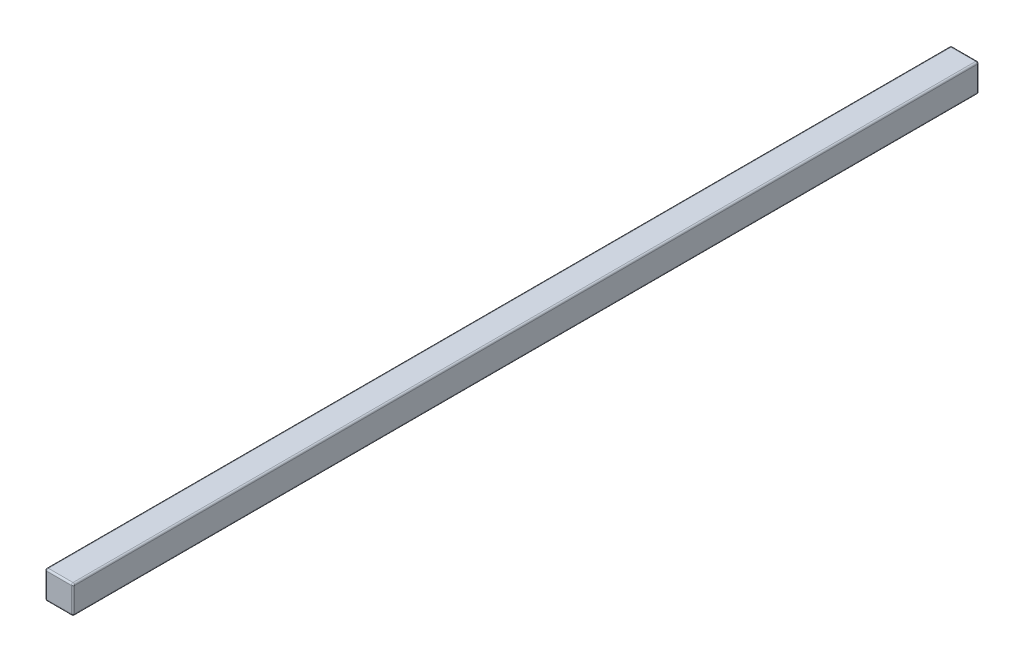
ISO-10303-21;
HEADER;
FILE_DESCRIPTION(('STEP AP214'),'2;1');
FILE_NAME('part.step','',(''),(''),'','','');
FILE_SCHEMA(('AUTOMOTIVE_DESIGN { 1 0 10303 214 1 1 1 1 }'));
ENDSEC;
DATA;
#1=APPLICATION_CONTEXT('core data for automotive mechanical design processes');
#2=APPLICATION_PROTOCOL_DEFINITION('international standard','automotive_design',2000,#1);
#3=PRODUCT_CONTEXT('',#1,'mechanical');
#4=PRODUCT('Part','Part','',(#3));
#5=PRODUCT_RELATED_PRODUCT_CATEGORY('part','',(#4));
#6=PRODUCT_DEFINITION_FORMATION('','',#4);
#7=PRODUCT_DEFINITION_CONTEXT('part definition',#1,'design');
#8=PRODUCT_DEFINITION('design','',#6,#7);
#9=PRODUCT_DEFINITION_SHAPE('','',#8);
#10=(LENGTH_UNIT() NAMED_UNIT(*) SI_UNIT(.MILLI.,.METRE.));
#11=(NAMED_UNIT(*) PLANE_ANGLE_UNIT() SI_UNIT($,.RADIAN.));
#12=(NAMED_UNIT(*) SI_UNIT($,.STERADIAN.) SOLID_ANGLE_UNIT());
#13=UNCERTAINTY_MEASURE_WITH_UNIT(LENGTH_MEASURE(1.E-05),#10,'distance_accuracy_value','');
#14=(GEOMETRIC_REPRESENTATION_CONTEXT(3) GLOBAL_UNCERTAINTY_ASSIGNED_CONTEXT((#13)) GLOBAL_UNIT_ASSIGNED_CONTEXT((#10,
#11,#12)) REPRESENTATION_CONTEXT('',''));
#15=CARTESIAN_POINT('',(0.,0.,0.));
#16=DIRECTION('',(0.,0.,1.));
#17=DIRECTION('',(1.,0.,0.));
#18=AXIS2_PLACEMENT_3D('',#15,#16,#17);
#19=CARTESIAN_POINT('',(12.5,-12.5,808.79));
#20=DIRECTION('',(-1.,0.,0.));
#21=DIRECTION('',(0.,0.,1.));
#22=AXIS2_PLACEMENT_3D('',#19,#20,#21);
#23=PLANE('',#22);
#24=DIRECTION('',(0.,1.,0.));
#25=VECTOR('',#24,1.);
#26=CARTESIAN_POINT('',(12.5,-12.5,807.29));
#27=LINE('',#26,#25);
#28=CARTESIAN_POINT('',(12.5,11.,807.29));
#29=VERTEX_POINT('',#28);
#30=CARTESIAN_POINT('',(12.5,-11.,807.29));
#31=VERTEX_POINT('',#30);
#32=EDGE_CURVE('E156',#29,#31,#27,.F.);
#33=ORIENTED_EDGE('',*,*,#32,.T.);
#34=DIRECTION('',(0.,0.,-1.));
#35=VECTOR('',#34,1.);
#36=CARTESIAN_POINT('',(12.5,-11.,808.79));
#37=LINE('',#36,#35);
#38=CARTESIAN_POINT('',(12.5,-11.,1.49999999999995));
#39=VERTEX_POINT('',#38);
#40=EDGE_CURVE('E235',#31,#39,#37,.T.);
#41=ORIENTED_EDGE('',*,*,#40,.T.);
#42=DIRECTION('',(0.,1.,0.));
#43=VECTOR('',#42,1.);
#44=CARTESIAN_POINT('',(12.5,12.5,1.49999999999995));
#45=LINE('',#44,#43);
#46=CARTESIAN_POINT('',(12.5,11.,1.49999999999995));
#47=VERTEX_POINT('',#46);
#48=EDGE_CURVE('E232',#39,#47,#45,.T.);
#49=ORIENTED_EDGE('',*,*,#48,.T.);
#50=DIRECTION('',(0.,0.,-1.));
#51=VECTOR('',#50,1.);
#52=CARTESIAN_POINT('',(12.5,11.,808.79));
#53=LINE('',#52,#51);
#54=EDGE_CURVE('E230',#47,#29,#53,.F.);
#55=ORIENTED_EDGE('',*,*,#54,.T.);
#56=EDGE_LOOP('',(#33,#41,#49,#55));
#57=FACE_BOUND('',#56,.T.);
#58=ADVANCED_FACE('F37',(#57),#23,.F.);
#59=CARTESIAN_POINT('',(-12.5,12.5,808.79));
#60=DIRECTION('',(0.,-1.,0.));
#61=DIRECTION('',(0.,0.,-1.));
#62=AXIS2_PLACEMENT_3D('',#59,#60,#61);
#63=PLANE('',#62);
#64=DIRECTION('',(-1.,0.,0.));
#65=VECTOR('',#64,1.);
#66=CARTESIAN_POINT('',(-12.5,12.5,807.29));
#67=LINE('',#66,#65);
#68=CARTESIAN_POINT('',(-11.,12.5,807.29));
#69=VERTEX_POINT('',#68);
#70=CARTESIAN_POINT('',(11.,12.5,807.29));
#71=VERTEX_POINT('',#70);
#72=EDGE_CURVE('E46',#69,#71,#67,.F.);
#73=ORIENTED_EDGE('',*,*,#72,.T.);
#74=DIRECTION('',(0.,0.,-1.));
#75=VECTOR('',#74,1.);
#76=CARTESIAN_POINT('',(11.,12.5,808.79));
#77=LINE('',#76,#75);
#78=CARTESIAN_POINT('',(11.,12.5,1.49999999999995));
#79=VERTEX_POINT('',#78);
#80=EDGE_CURVE('E11',#71,#79,#77,.T.);
#81=ORIENTED_EDGE('',*,*,#80,.T.);
#82=DIRECTION('',(-1.,0.,0.));
#83=VECTOR('',#82,1.);
#84=CARTESIAN_POINT('',(-12.5,12.5,1.49999999999995));
#85=LINE('',#84,#83);
#86=CARTESIAN_POINT('',(-11.,12.5,1.49999999999995));
#87=VERTEX_POINT('',#86);
#88=EDGE_CURVE('E238',#79,#87,#85,.T.);
#89=ORIENTED_EDGE('',*,*,#88,.T.);
#90=DIRECTION('',(0.,0.,-1.));
#91=VECTOR('',#90,1.);
#92=CARTESIAN_POINT('',(-11.,12.5,808.79));
#93=LINE('',#92,#91);
#94=EDGE_CURVE('E57',#87,#69,#93,.F.);
#95=ORIENTED_EDGE('',*,*,#94,.T.);
#96=EDGE_LOOP('',(#73,#81,#89,#95));
#97=FACE_BOUND('',#96,.T.);
#98=ADVANCED_FACE('F328',(#97),#63,.F.);
#99=CARTESIAN_POINT('',(-12.5,-12.5,808.79));
#100=DIRECTION('',(1.,0.,0.));
#101=DIRECTION('',(0.,0.,-1.));
#102=AXIS2_PLACEMENT_3D('',#99,#100,#101);
#103=PLANE('',#102);
#104=DIRECTION('',(0.,0.,-1.));
#105=VECTOR('',#104,1.);
#106=CARTESIAN_POINT('',(-12.5,-11.,808.79));
#107=LINE('',#106,#105);
#108=CARTESIAN_POINT('',(-12.5,-11.,1.49999999999995));
#109=VERTEX_POINT('',#108);
#110=CARTESIAN_POINT('',(-12.5,-11.,807.29));
#111=VERTEX_POINT('',#110);
#112=EDGE_CURVE('E219',#109,#111,#107,.F.);
#113=ORIENTED_EDGE('',*,*,#112,.T.);
#114=DIRECTION('',(0.,-1.,0.));
#115=VECTOR('',#114,1.);
#116=CARTESIAN_POINT('',(-12.5,-12.5,807.29));
#117=LINE('',#116,#115);
#118=CARTESIAN_POINT('',(-12.5,11.,807.29));
#119=VERTEX_POINT('',#118);
#120=EDGE_CURVE('E222',#111,#119,#117,.F.);
#121=ORIENTED_EDGE('',*,*,#120,.T.);
#122=DIRECTION('',(0.,0.,-1.));
#123=VECTOR('',#122,1.);
#124=CARTESIAN_POINT('',(-12.5,11.,808.79));
#125=LINE('',#124,#123);
#126=CARTESIAN_POINT('',(-12.5,11.,1.49999999999995));
#127=VERTEX_POINT('',#126);
#128=EDGE_CURVE('E220',#119,#127,#125,.T.);
#129=ORIENTED_EDGE('',*,*,#128,.T.);
#130=DIRECTION('',(0.,-1.,0.));
#131=VECTOR('',#130,1.);
#132=CARTESIAN_POINT('',(-12.5,-12.5,1.49999999999995));
#133=LINE('',#132,#131);
#134=EDGE_CURVE('E216',#127,#109,#133,.T.);
#135=ORIENTED_EDGE('',*,*,#134,.T.);
#136=EDGE_LOOP('',(#113,#121,#129,#135));
#137=FACE_BOUND('',#136,.T.);
#138=ADVANCED_FACE('F310',(#137),#103,.F.);
#139=CARTESIAN_POINT('',(-12.5,-12.5,808.79));
#140=DIRECTION('',(0.,1.,0.));
#141=DIRECTION('',(0.,0.,1.));
#142=AXIS2_PLACEMENT_3D('',#139,#140,#141);
#143=PLANE('',#142);
#144=DIRECTION('',(1.,0.,0.));
#145=VECTOR('',#144,1.);
#146=CARTESIAN_POINT('',(-12.5,-12.5,807.29));
#147=LINE('',#146,#145);
#148=CARTESIAN_POINT('',(11.,-12.5,807.29));
#149=VERTEX_POINT('',#148);
#150=CARTESIAN_POINT('',(-11.,-12.5,807.29));
#151=VERTEX_POINT('',#150);
#152=EDGE_CURVE('E269',#149,#151,#147,.F.);
#153=ORIENTED_EDGE('',*,*,#152,.T.);
#154=DIRECTION('',(0.,0.,-1.));
#155=VECTOR('',#154,1.);
#156=CARTESIAN_POINT('',(-11.,-12.5,808.79));
#157=LINE('',#156,#155);
#158=CARTESIAN_POINT('',(-11.,-12.5,1.49999999999995));
#159=VERTEX_POINT('',#158);
#160=EDGE_CURVE('E263',#151,#159,#157,.T.);
#161=ORIENTED_EDGE('',*,*,#160,.T.);
#162=DIRECTION('',(1.,0.,0.));
#163=VECTOR('',#162,1.);
#164=CARTESIAN_POINT('',(12.5,-12.5,1.49999999999995));
#165=LINE('',#164,#163);
#166=CARTESIAN_POINT('',(11.,-12.5,1.49999999999995));
#167=VERTEX_POINT('',#166);
#168=EDGE_CURVE('E278',#159,#167,#165,.T.);
#169=ORIENTED_EDGE('',*,*,#168,.T.);
#170=DIRECTION('',(0.,0.,-1.));
#171=VECTOR('',#170,1.);
#172=CARTESIAN_POINT('',(11.,-12.5,808.79));
#173=LINE('',#172,#171);
#174=EDGE_CURVE('E274',#167,#149,#173,.F.);
#175=ORIENTED_EDGE('',*,*,#174,.T.);
#176=EDGE_LOOP('',(#153,#161,#169,#175));
#177=FACE_BOUND('',#176,.T.);
#178=ADVANCED_FACE('F272',(#177),#143,.F.);
#179=CARTESIAN_POINT('',(0.,0.,808.79));
#180=DIRECTION('',(0.,0.,-1.));
#181=DIRECTION('',(-1.,0.,0.));
#182=AXIS2_PLACEMENT_3D('',#179,#180,#181);
#183=PLANE('',#182);
#184=DIRECTION('',(0.,-1.,0.));
#185=VECTOR('',#184,1.);
#186=CARTESIAN_POINT('',(-11.,0.,808.79));
#187=LINE('',#186,#185);
#188=CARTESIAN_POINT('',(-11.,11.,808.79));
#189=VERTEX_POINT('',#188);
#190=CARTESIAN_POINT('',(-11.,-11.,808.79));
#191=VERTEX_POINT('',#190);
#192=EDGE_CURVE('E135',#189,#191,#187,.T.);
#193=ORIENTED_EDGE('',*,*,#192,.T.);
#194=DIRECTION('',(1.,0.,0.));
#195=VECTOR('',#194,1.);
#196=CARTESIAN_POINT('',(0.,-11.,808.79));
#197=LINE('',#196,#195);
#198=CARTESIAN_POINT('',(11.,-11.,808.79));
#199=VERTEX_POINT('',#198);
#200=EDGE_CURVE('E131',#191,#199,#197,.T.);
#201=ORIENTED_EDGE('',*,*,#200,.T.);
#202=DIRECTION('',(0.,1.,0.));
#203=VECTOR('',#202,1.);
#204=CARTESIAN_POINT('',(11.,0.,808.79));
#205=LINE('',#204,#203);
#206=CARTESIAN_POINT('',(11.,11.,808.79));
#207=VERTEX_POINT('',#206);
#208=EDGE_CURVE('E125',#199,#207,#205,.T.);
#209=ORIENTED_EDGE('',*,*,#208,.T.);
#210=DIRECTION('',(-1.,0.,0.));
#211=VECTOR('',#210,1.);
#212=CARTESIAN_POINT('',(0.,11.,808.79));
#213=LINE('',#212,#211);
#214=EDGE_CURVE('E128',#207,#189,#213,.T.);
#215=ORIENTED_EDGE('',*,*,#214,.T.);
#216=EDGE_LOOP('',(#193,#201,#209,#215));
#217=FACE_BOUND('',#216,.T.);
#218=ADVANCED_FACE('F127',(#217),#183,.F.);
#219=CARTESIAN_POINT('',(0.,0.,0.));
#220=DIRECTION('',(0.,0.,-1.));
#221=DIRECTION('',(-1.,0.,0.));
#222=AXIS2_PLACEMENT_3D('',#219,#220,#221);
#223=PLANE('',#222);
#224=DIRECTION('',(0.,1.,0.));
#225=VECTOR('',#224,1.);
#226=CARTESIAN_POINT('',(11.,-12.5,0.));
#227=LINE('',#226,#225);
#228=CARTESIAN_POINT('',(11.,11.,0.));
#229=VERTEX_POINT('',#228);
#230=CARTESIAN_POINT('',(11.,-11.,0.));
#231=VERTEX_POINT('',#230);
#232=EDGE_CURVE('E284',#229,#231,#227,.F.);
#233=ORIENTED_EDGE('',*,*,#232,.T.);
#234=DIRECTION('',(1.,0.,0.));
#235=VECTOR('',#234,1.);
#236=CARTESIAN_POINT('',(-12.5,-11.,0.));
#237=LINE('',#236,#235);
#238=CARTESIAN_POINT('',(-11.,-11.,0.));
#239=VERTEX_POINT('',#238);
#240=EDGE_CURVE('E224',#231,#239,#237,.F.);
#241=ORIENTED_EDGE('',*,*,#240,.T.);
#242=DIRECTION('',(0.,-1.,0.));
#243=VECTOR('',#242,1.);
#244=CARTESIAN_POINT('',(-11.,12.5,0.));
#245=LINE('',#244,#243);
#246=CARTESIAN_POINT('',(-11.,11.,0.));
#247=VERTEX_POINT('',#246);
#248=EDGE_CURVE('E214',#239,#247,#245,.F.);
#249=ORIENTED_EDGE('',*,*,#248,.T.);
#250=DIRECTION('',(-1.,0.,0.));
#251=VECTOR('',#250,1.);
#252=CARTESIAN_POINT('',(12.5,11.,0.));
#253=LINE('',#252,#251);
#254=EDGE_CURVE('E268',#247,#229,#253,.F.);
#255=ORIENTED_EDGE('',*,*,#254,.T.);
#256=EDGE_LOOP('',(#233,#241,#249,#255));
#257=FACE_BOUND('',#256,.T.);
#258=ADVANCED_FACE('F288',(#257),#223,.T.);
#259=CARTESIAN_POINT('',(-12.5,11.,1.49999999999995));
#260=DIRECTION('',(1.,0.,0.));
#261=DIRECTION('',(0.,0.,-1.));
#262=AXIS2_PLACEMENT_3D('',#259,#260,#261);
#263=CYLINDRICAL_SURFACE('',#262,1.5);
#264=CARTESIAN_POINT('',(-11.,11.,1.49999999999995));
#265=DIRECTION('',(-1.,0.,0.));
#266=DIRECTION('',(0.,0.,1.));
#267=AXIS2_PLACEMENT_3D('',#264,#265,#266);
#268=CIRCLE('',#267,1.5);
#269=EDGE_CURVE('E41',#87,#247,#268,.T.);
#270=ORIENTED_EDGE('',*,*,#269,.F.);
#271=ORIENTED_EDGE('',*,*,#88,.F.);
#272=CARTESIAN_POINT('',(11.,11.,1.5));
#273=DIRECTION('',(1.,0.,0.));
#274=DIRECTION('',(0.,1.,0.));
#275=AXIS2_PLACEMENT_3D('',#272,#273,#274);
#276=CIRCLE('',#275,1.5);
#277=EDGE_CURVE('E194',#229,#79,#276,.T.);
#278=ORIENTED_EDGE('',*,*,#277,.F.);
#279=ORIENTED_EDGE('',*,*,#254,.F.);
#280=EDGE_LOOP('',(#270,#271,#278,#279));
#281=FACE_BOUND('',#280,.T.);
#282=ADVANCED_FACE('F39',(#281),#263,.T.);
#283=CARTESIAN_POINT('',(-11.,11.,1.5));
#284=DIRECTION('',(0.,0.,1.));
#285=DIRECTION('',(1.,0.,0.));
#286=AXIS2_PLACEMENT_3D('',#283,#284,#285);
#287=SPHERICAL_SURFACE('',#286,1.5);
#288=CARTESIAN_POINT('',(-11.,11.,1.49999999999995));
#289=DIRECTION('',(0.,0.,-1.));
#290=DIRECTION('',(-1.,0.,0.));
#291=AXIS2_PLACEMENT_3D('',#288,#289,#290);
#292=CIRCLE('',#291,1.5);
#293=EDGE_CURVE('E189',#87,#127,#292,.F.);
#294=ORIENTED_EDGE('',*,*,#293,.F.);
#295=ORIENTED_EDGE('',*,*,#269,.T.);
#296=CARTESIAN_POINT('',(-11.,11.,1.5));
#297=DIRECTION('',(0.,1.,0.));
#298=DIRECTION('',(-1.,0.,0.));
#299=AXIS2_PLACEMENT_3D('',#296,#297,#298);
#300=CIRCLE('',#299,1.5);
#301=EDGE_CURVE('E192',#127,#247,#300,.F.);
#302=ORIENTED_EDGE('',*,*,#301,.F.);
#303=EDGE_LOOP('',(#294,#295,#302));
#304=FACE_BOUND('',#303,.T.);
#305=ADVANCED_FACE('F206',(#304),#287,.T.);
#306=CARTESIAN_POINT('',(11.,11.,1.5));
#307=DIRECTION('',(0.,0.,1.));
#308=DIRECTION('',(1.,0.,0.));
#309=AXIS2_PLACEMENT_3D('',#306,#307,#308);
#310=SPHERICAL_SURFACE('',#309,1.5);
#311=CARTESIAN_POINT('',(11.,11.,1.49999999999995));
#312=DIRECTION('',(0.,1.,0.));
#313=DIRECTION('',(0.,0.,1.));
#314=AXIS2_PLACEMENT_3D('',#311,#312,#313);
#315=CIRCLE('',#314,1.5);
#316=EDGE_CURVE('E184',#229,#47,#315,.F.);
#317=ORIENTED_EDGE('',*,*,#316,.F.);
#318=ORIENTED_EDGE('',*,*,#277,.T.);
#319=CARTESIAN_POINT('',(11.,11.,1.49999999999995));
#320=DIRECTION('',(0.,0.,-1.));
#321=DIRECTION('',(-1.,0.,0.));
#322=AXIS2_PLACEMENT_3D('',#319,#320,#321);
#323=CIRCLE('',#322,1.5);
#324=EDGE_CURVE('E187',#47,#79,#323,.F.);
#325=ORIENTED_EDGE('',*,*,#324,.F.);
#326=EDGE_LOOP('',(#317,#318,#325));
#327=FACE_BOUND('',#326,.T.);
#328=ADVANCED_FACE('F461',(#327),#310,.T.);
#329=CARTESIAN_POINT('',(-11.,-12.5,1.49999999999995));
#330=DIRECTION('',(0.,1.,0.));
#331=DIRECTION('',(0.,0.,1.));
#332=AXIS2_PLACEMENT_3D('',#329,#330,#331);
#333=CYLINDRICAL_SURFACE('',#332,1.5);
#334=ORIENTED_EDGE('',*,*,#301,.T.);
#335=ORIENTED_EDGE('',*,*,#248,.F.);
#336=CARTESIAN_POINT('',(-11.,-11.,1.49999999999995));
#337=DIRECTION('',(0.,-1.,0.));
#338=DIRECTION('',(0.,0.,-1.));
#339=AXIS2_PLACEMENT_3D('',#336,#337,#338);
#340=CIRCLE('',#339,1.5);
#341=EDGE_CURVE('E179',#109,#239,#340,.T.);
#342=ORIENTED_EDGE('',*,*,#341,.F.);
#343=ORIENTED_EDGE('',*,*,#134,.F.);
#344=EDGE_LOOP('',(#334,#335,#342,#343));
#345=FACE_BOUND('',#344,.T.);
#346=ADVANCED_FACE('F212',(#345),#333,.T.);
#347=CARTESIAN_POINT('',(-11.,11.,808.79));
#348=DIRECTION('',(0.,0.,-1.));
#349=DIRECTION('',(-1.,0.,0.));
#350=AXIS2_PLACEMENT_3D('',#347,#348,#349);
#351=CYLINDRICAL_SURFACE('',#350,1.5);
#352=ORIENTED_EDGE('',*,*,#293,.T.);
#353=ORIENTED_EDGE('',*,*,#128,.F.);
#354=CARTESIAN_POINT('',(-11.,11.,807.29));
#355=DIRECTION('',(0.,0.,1.));
#356=DIRECTION('',(1.,0.,0.));
#357=AXIS2_PLACEMENT_3D('',#354,#355,#356);
#358=CIRCLE('',#357,1.5);
#359=EDGE_CURVE('E176',#69,#119,#358,.T.);
#360=ORIENTED_EDGE('',*,*,#359,.F.);
#361=ORIENTED_EDGE('',*,*,#94,.F.);
#362=EDGE_LOOP('',(#352,#353,#360,#361));
#363=FACE_BOUND('',#362,.T.);
#364=ADVANCED_FACE('F314',(#363),#351,.T.);
#365=CARTESIAN_POINT('',(0.,11.,807.29));
#366=DIRECTION('',(-1.,0.,0.));
#367=DIRECTION('',(0.,0.,1.));
#368=AXIS2_PLACEMENT_3D('',#365,#366,#367);
#369=CYLINDRICAL_SURFACE('',#368,1.5);
#370=CARTESIAN_POINT('',(11.,11.,807.29));
#371=DIRECTION('',(1.,0.,0.));
#372=DIRECTION('',(0.,0.,-1.));
#373=AXIS2_PLACEMENT_3D('',#370,#371,#372);
#374=CIRCLE('',#373,1.5);
#375=EDGE_CURVE('E141',#71,#207,#374,.T.);
#376=ORIENTED_EDGE('',*,*,#375,.F.);
#377=ORIENTED_EDGE('',*,*,#72,.F.);
#378=CARTESIAN_POINT('',(-11.,11.,807.29));
#379=DIRECTION('',(-1.,0.,0.));
#380=DIRECTION('',(0.,0.,1.));
#381=AXIS2_PLACEMENT_3D('',#378,#379,#380);
#382=CIRCLE('',#381,1.5);
#383=EDGE_CURVE('E144',#189,#69,#382,.T.);
#384=ORIENTED_EDGE('',*,*,#383,.F.);
#385=ORIENTED_EDGE('',*,*,#214,.F.);
#386=EDGE_LOOP('',(#376,#377,#384,#385));
#387=FACE_BOUND('',#386,.T.);
#388=ADVANCED_FACE('F140',(#387),#369,.T.);
#389=CARTESIAN_POINT('',(11.,11.,808.79));
#390=DIRECTION('',(0.,0.,-1.));
#391=DIRECTION('',(-1.,0.,0.));
#392=AXIS2_PLACEMENT_3D('',#389,#390,#391);
#393=CYLINDRICAL_SURFACE('',#392,1.5);
#394=ORIENTED_EDGE('',*,*,#324,.T.);
#395=ORIENTED_EDGE('',*,*,#80,.F.);
#396=CARTESIAN_POINT('',(11.,11.,807.29));
#397=DIRECTION('',(0.,0.,1.));
#398=DIRECTION('',(1.,0.,0.));
#399=AXIS2_PLACEMENT_3D('',#396,#397,#398);
#400=CIRCLE('',#399,1.5);
#401=EDGE_CURVE('E153',#29,#71,#400,.T.);
#402=ORIENTED_EDGE('',*,*,#401,.F.);
#403=ORIENTED_EDGE('',*,*,#54,.F.);
#404=EDGE_LOOP('',(#394,#395,#402,#403));
#405=FACE_BOUND('',#404,.T.);
#406=ADVANCED_FACE('F431',(#405),#393,.T.);
#407=CARTESIAN_POINT('',(11.,-12.5,1.49999999999995));
#408=DIRECTION('',(0.,-1.,0.));
#409=DIRECTION('',(0.,0.,-1.));
#410=AXIS2_PLACEMENT_3D('',#407,#408,#409);
#411=CYLINDRICAL_SURFACE('',#410,1.5);
#412=ORIENTED_EDGE('',*,*,#316,.T.);
#413=ORIENTED_EDGE('',*,*,#48,.F.);
#414=CARTESIAN_POINT('',(11.,-11.,1.5));
#415=DIRECTION('',(0.,-1.,0.));
#416=DIRECTION('',(0.,0.,-1.));
#417=AXIS2_PLACEMENT_3D('',#414,#415,#416);
#418=CIRCLE('',#417,1.5);
#419=EDGE_CURVE('E171',#231,#39,#418,.T.);
#420=ORIENTED_EDGE('',*,*,#419,.F.);
#421=ORIENTED_EDGE('',*,*,#232,.F.);
#422=EDGE_LOOP('',(#412,#413,#420,#421));
#423=FACE_BOUND('',#422,.T.);
#424=ADVANCED_FACE('F298',(#423),#411,.T.);
#425=CARTESIAN_POINT('',(-12.5,-11.,1.49999999999995));
#426=DIRECTION('',(-1.,0.,0.));
#427=DIRECTION('',(0.,0.,1.));
#428=AXIS2_PLACEMENT_3D('',#425,#426,#427);
#429=CYLINDRICAL_SURFACE('',#428,1.5);
#430=CARTESIAN_POINT('',(-11.,-11.,1.5));
#431=DIRECTION('',(-1.,0.,0.));
#432=DIRECTION('',(0.,0.,1.));
#433=AXIS2_PLACEMENT_3D('',#430,#431,#432);
#434=CIRCLE('',#433,1.5);
#435=EDGE_CURVE('E181',#239,#159,#434,.T.);
#436=ORIENTED_EDGE('',*,*,#435,.F.);
#437=ORIENTED_EDGE('',*,*,#240,.F.);
#438=CARTESIAN_POINT('',(11.,-11.,1.49999999999995));
#439=DIRECTION('',(1.,0.,0.));
#440=DIRECTION('',(0.,0.,-1.));
#441=AXIS2_PLACEMENT_3D('',#438,#439,#440);
#442=CIRCLE('',#441,1.5);
#443=EDGE_CURVE('E168',#167,#231,#442,.T.);
#444=ORIENTED_EDGE('',*,*,#443,.F.);
#445=ORIENTED_EDGE('',*,*,#168,.F.);
#446=EDGE_LOOP('',(#436,#437,#444,#445));
#447=FACE_BOUND('',#446,.T.);
#448=ADVANCED_FACE('F294',(#447),#429,.T.);
#449=CARTESIAN_POINT('',(-11.,-11.,1.5));
#450=DIRECTION('',(0.,0.,1.));
#451=DIRECTION('',(1.,0.,0.));
#452=AXIS2_PLACEMENT_3D('',#449,#450,#451);
#453=SPHERICAL_SURFACE('',#452,1.5);
#454=ORIENTED_EDGE('',*,*,#341,.T.);
#455=ORIENTED_EDGE('',*,*,#435,.T.);
#456=CARTESIAN_POINT('',(-11.,-11.,1.49999999999995));
#457=DIRECTION('',(0.,0.,-1.));
#458=DIRECTION('',(-1.,0.,0.));
#459=AXIS2_PLACEMENT_3D('',#456,#457,#458);
#460=CIRCLE('',#459,1.5);
#461=EDGE_CURVE('E160',#109,#159,#460,.F.);
#462=ORIENTED_EDGE('',*,*,#461,.F.);
#463=EDGE_LOOP('',(#454,#455,#462));
#464=FACE_BOUND('',#463,.T.);
#465=ADVANCED_FACE('F318',(#464),#453,.T.);
#466=CARTESIAN_POINT('',(-11.,11.,807.29));
#467=DIRECTION('',(0.,0.,1.));
#468=DIRECTION('',(1.,0.,0.));
#469=AXIS2_PLACEMENT_3D('',#466,#467,#468);
#470=SPHERICAL_SURFACE('',#469,1.5);
#471=ORIENTED_EDGE('',*,*,#383,.T.);
#472=ORIENTED_EDGE('',*,*,#359,.T.);
#473=CARTESIAN_POINT('',(-11.,11.,807.29));
#474=DIRECTION('',(0.,1.,0.));
#475=DIRECTION('',(0.,0.,1.));
#476=AXIS2_PLACEMENT_3D('',#473,#474,#475);
#477=CIRCLE('',#476,1.5);
#478=EDGE_CURVE('E157',#189,#119,#477,.F.);
#479=ORIENTED_EDGE('',*,*,#478,.F.);
#480=EDGE_LOOP('',(#471,#472,#479));
#481=FACE_BOUND('',#480,.T.);
#482=ADVANCED_FACE('F316',(#481),#470,.T.);
#483=CARTESIAN_POINT('',(11.,11.,807.29));
#484=DIRECTION('',(0.,0.,1.));
#485=DIRECTION('',(1.,0.,0.));
#486=AXIS2_PLACEMENT_3D('',#483,#484,#485);
#487=SPHERICAL_SURFACE('',#486,1.5);
#488=ORIENTED_EDGE('',*,*,#401,.T.);
#489=ORIENTED_EDGE('',*,*,#375,.T.);
#490=CARTESIAN_POINT('',(11.,11.,807.29));
#491=DIRECTION('',(0.,1.,0.));
#492=DIRECTION('',(0.,0.,1.));
#493=AXIS2_PLACEMENT_3D('',#490,#491,#492);
#494=CIRCLE('',#493,1.5);
#495=EDGE_CURVE('E150',#29,#207,#494,.F.);
#496=ORIENTED_EDGE('',*,*,#495,.F.);
#497=EDGE_LOOP('',(#488,#489,#496));
#498=FACE_BOUND('',#497,.T.);
#499=ADVANCED_FACE('F149',(#498),#487,.T.);
#500=CARTESIAN_POINT('',(11.,-11.,1.5));
#501=DIRECTION('',(0.,0.,1.));
#502=DIRECTION('',(1.,0.,0.));
#503=AXIS2_PLACEMENT_3D('',#500,#501,#502);
#504=SPHERICAL_SURFACE('',#503,1.5);
#505=ORIENTED_EDGE('',*,*,#443,.T.);
#506=ORIENTED_EDGE('',*,*,#419,.T.);
#507=CARTESIAN_POINT('',(11.,-11.,1.49999999999995));
#508=DIRECTION('',(0.,0.,-1.));
#509=DIRECTION('',(-1.,0.,0.));
#510=AXIS2_PLACEMENT_3D('',#507,#508,#509);
#511=CIRCLE('',#510,1.5);
#512=EDGE_CURVE('E158',#167,#39,#511,.F.);
#513=ORIENTED_EDGE('',*,*,#512,.F.);
#514=EDGE_LOOP('',(#505,#506,#513));
#515=FACE_BOUND('',#514,.T.);
#516=ADVANCED_FACE('F300',(#515),#504,.T.);
#517=CARTESIAN_POINT('',(-11.,-11.,808.79));
#518=DIRECTION('',(0.,0.,-1.));
#519=DIRECTION('',(-1.,0.,0.));
#520=AXIS2_PLACEMENT_3D('',#517,#518,#519);
#521=CYLINDRICAL_SURFACE('',#520,1.5);
#522=ORIENTED_EDGE('',*,*,#461,.T.);
#523=ORIENTED_EDGE('',*,*,#160,.F.);
#524=CARTESIAN_POINT('',(-11.,-11.,807.29));
#525=DIRECTION('',(0.,0.,1.));
#526=DIRECTION('',(1.,0.,0.));
#527=AXIS2_PLACEMENT_3D('',#524,#525,#526);
#528=CIRCLE('',#527,1.5);
#529=EDGE_CURVE('E162',#111,#151,#528,.T.);
#530=ORIENTED_EDGE('',*,*,#529,.F.);
#531=ORIENTED_EDGE('',*,*,#112,.F.);
#532=EDGE_LOOP('',(#522,#523,#530,#531));
#533=FACE_BOUND('',#532,.T.);
#534=ADVANCED_FACE('F265',(#533),#521,.T.);
#535=CARTESIAN_POINT('',(-11.,0.,807.29));
#536=DIRECTION('',(0.,-1.,0.));
#537=DIRECTION('',(0.,0.,-1.));
#538=AXIS2_PLACEMENT_3D('',#535,#536,#537);
#539=CYLINDRICAL_SURFACE('',#538,1.5);
#540=ORIENTED_EDGE('',*,*,#478,.T.);
#541=ORIENTED_EDGE('',*,*,#120,.F.);
#542=CARTESIAN_POINT('',(-11.,-11.,807.29));
#543=DIRECTION('',(0.,-1.,0.));
#544=DIRECTION('',(0.,0.,-1.));
#545=AXIS2_PLACEMENT_3D('',#542,#543,#544);
#546=CIRCLE('',#545,1.5);
#547=EDGE_CURVE('E252',#191,#111,#546,.T.);
#548=ORIENTED_EDGE('',*,*,#547,.F.);
#549=ORIENTED_EDGE('',*,*,#192,.F.);
#550=EDGE_LOOP('',(#540,#541,#548,#549));
#551=FACE_BOUND('',#550,.T.);
#552=ADVANCED_FACE('F309',(#551),#539,.T.);
#553=CARTESIAN_POINT('',(11.,0.,807.29));
#554=DIRECTION('',(0.,1.,0.));
#555=DIRECTION('',(0.,0.,1.));
#556=AXIS2_PLACEMENT_3D('',#553,#554,#555);
#557=CYLINDRICAL_SURFACE('',#556,1.5);
#558=ORIENTED_EDGE('',*,*,#495,.T.);
#559=ORIENTED_EDGE('',*,*,#208,.F.);
#560=CARTESIAN_POINT('',(11.,-11.,807.29));
#561=DIRECTION('',(0.,-1.,0.));
#562=DIRECTION('',(0.,0.,-1.));
#563=AXIS2_PLACEMENT_3D('',#560,#561,#562);
#564=CIRCLE('',#563,1.5);
#565=EDGE_CURVE('E249',#31,#199,#564,.T.);
#566=ORIENTED_EDGE('',*,*,#565,.F.);
#567=ORIENTED_EDGE('',*,*,#32,.F.);
#568=EDGE_LOOP('',(#558,#559,#566,#567));
#569=FACE_BOUND('',#568,.T.);
#570=ADVANCED_FACE('F155',(#569),#557,.T.);
#571=CARTESIAN_POINT('',(11.,-11.,808.79));
#572=DIRECTION('',(0.,0.,-1.));
#573=DIRECTION('',(-1.,0.,0.));
#574=AXIS2_PLACEMENT_3D('',#571,#572,#573);
#575=CYLINDRICAL_SURFACE('',#574,1.5);
#576=ORIENTED_EDGE('',*,*,#512,.T.);
#577=ORIENTED_EDGE('',*,*,#40,.F.);
#578=CARTESIAN_POINT('',(11.,-11.,807.29));
#579=DIRECTION('',(0.,0.,1.));
#580=DIRECTION('',(1.,0.,0.));
#581=AXIS2_PLACEMENT_3D('',#578,#579,#580);
#582=CIRCLE('',#581,1.5);
#583=EDGE_CURVE('E246',#149,#31,#582,.T.);
#584=ORIENTED_EDGE('',*,*,#583,.F.);
#585=ORIENTED_EDGE('',*,*,#174,.F.);
#586=EDGE_LOOP('',(#576,#577,#584,#585));
#587=FACE_BOUND('',#586,.T.);
#588=ADVANCED_FACE('F303',(#587),#575,.T.);
#589=CARTESIAN_POINT('',(-11.,-11.,807.29));
#590=DIRECTION('',(0.,0.,1.));
#591=DIRECTION('',(1.,0.,0.));
#592=AXIS2_PLACEMENT_3D('',#589,#590,#591);
#593=SPHERICAL_SURFACE('',#592,1.5);
#594=ORIENTED_EDGE('',*,*,#547,.T.);
#595=ORIENTED_EDGE('',*,*,#529,.T.);
#596=CARTESIAN_POINT('',(-11.,-11.,807.29));
#597=DIRECTION('',(-1.,0.,0.));
#598=DIRECTION('',(0.,0.,1.));
#599=AXIS2_PLACEMENT_3D('',#596,#597,#598);
#600=CIRCLE('',#599,1.5);
#601=EDGE_CURVE('E244',#191,#151,#600,.F.);
#602=ORIENTED_EDGE('',*,*,#601,.F.);
#603=EDGE_LOOP('',(#594,#595,#602));
#604=FACE_BOUND('',#603,.T.);
#605=ADVANCED_FACE('F259',(#604),#593,.T.);
#606=CARTESIAN_POINT('',(11.,-11.,807.29));
#607=DIRECTION('',(0.,0.,1.));
#608=DIRECTION('',(1.,0.,0.));
#609=AXIS2_PLACEMENT_3D('',#606,#607,#608);
#610=SPHERICAL_SURFACE('',#609,1.5);
#611=ORIENTED_EDGE('',*,*,#583,.T.);
#612=ORIENTED_EDGE('',*,*,#565,.T.);
#613=CARTESIAN_POINT('',(11.,-11.,807.29));
#614=DIRECTION('',(1.,0.,0.));
#615=DIRECTION('',(0.,0.,-1.));
#616=AXIS2_PLACEMENT_3D('',#613,#614,#615);
#617=CIRCLE('',#616,1.5);
#618=EDGE_CURVE('E242',#149,#199,#617,.F.);
#619=ORIENTED_EDGE('',*,*,#618,.F.);
#620=EDGE_LOOP('',(#611,#612,#619));
#621=FACE_BOUND('',#620,.T.);
#622=ADVANCED_FACE('F340',(#621),#610,.T.);
#623=CARTESIAN_POINT('',(0.,-11.,807.29));
#624=DIRECTION('',(1.,0.,0.));
#625=DIRECTION('',(0.,0.,-1.));
#626=AXIS2_PLACEMENT_3D('',#623,#624,#625);
#627=CYLINDRICAL_SURFACE('',#626,1.5);
#628=ORIENTED_EDGE('',*,*,#601,.T.);
#629=ORIENTED_EDGE('',*,*,#152,.F.);
#630=ORIENTED_EDGE('',*,*,#618,.T.);
#631=ORIENTED_EDGE('',*,*,#200,.F.);
#632=EDGE_LOOP('',(#628,#629,#630,#631));
#633=FACE_BOUND('',#632,.T.);
#634=ADVANCED_FACE('F337',(#633),#627,.T.);
#635=CLOSED_SHELL('',(#58,#98,#138,#178,#218,#258,#282,#305,#328,#346,#364,#388,#406,#424,#448,
#465,#482,#499,#516,#534,#552,#570,#588,#605,#622,#634));
#636=MANIFOLD_SOLID_BREP('B2',#635);
#637=ADVANCED_BREP_SHAPE_REPRESENTATION('',(#18,#636),#14);
#638=SHAPE_DEFINITION_REPRESENTATION(#9,#637);
ENDSEC;
END-ISO-10303-21;
